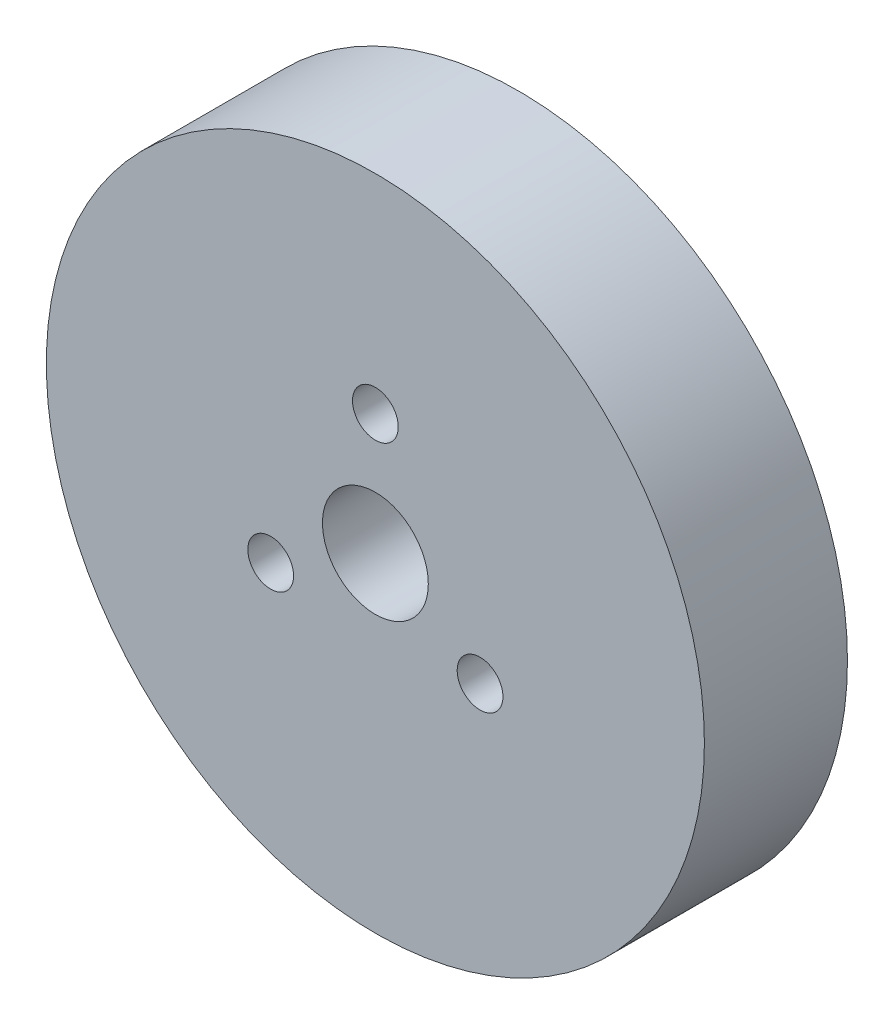
ISO-10303-21;
HEADER;
FILE_DESCRIPTION(('STEP AP214'),'2;1');
FILE_NAME('part.step','',(''),(''),'','','');
FILE_SCHEMA(('AUTOMOTIVE_DESIGN { 1 0 10303 214 1 1 1 1 }'));
ENDSEC;
DATA;
#1=APPLICATION_CONTEXT('core data for automotive mechanical design processes');
#2=APPLICATION_PROTOCOL_DEFINITION('international standard','automotive_design',2000,#1);
#3=PRODUCT_CONTEXT('',#1,'mechanical');
#4=PRODUCT('Part','Part','',(#3));
#5=PRODUCT_RELATED_PRODUCT_CATEGORY('part','',(#4));
#6=PRODUCT_DEFINITION_FORMATION('','',#4);
#7=PRODUCT_DEFINITION_CONTEXT('part definition',#1,'design');
#8=PRODUCT_DEFINITION('design','',#6,#7);
#9=PRODUCT_DEFINITION_SHAPE('','',#8);
#10=(LENGTH_UNIT() NAMED_UNIT(*) SI_UNIT(.MILLI.,.METRE.));
#11=(NAMED_UNIT(*) PLANE_ANGLE_UNIT() SI_UNIT($,.RADIAN.));
#12=(NAMED_UNIT(*) SI_UNIT($,.STERADIAN.) SOLID_ANGLE_UNIT());
#13=UNCERTAINTY_MEASURE_WITH_UNIT(LENGTH_MEASURE(1.E-05),#10,'distance_accuracy_value','');
#14=(GEOMETRIC_REPRESENTATION_CONTEXT(3) GLOBAL_UNCERTAINTY_ASSIGNED_CONTEXT((#13)) GLOBAL_UNIT_ASSIGNED_CONTEXT((#10,
#11,#12)) REPRESENTATION_CONTEXT('',''));
#15=CARTESIAN_POINT('',(0.,0.,0.));
#16=DIRECTION('',(0.,0.,1.));
#17=DIRECTION('',(1.,0.,0.));
#18=AXIS2_PLACEMENT_3D('',#15,#16,#17);
#19=CARTESIAN_POINT('',(0.,0.,10.));
#20=DIRECTION('',(0.,0.,-1.));
#21=DIRECTION('',(-1.,0.,0.));
#22=AXIS2_PLACEMENT_3D('',#19,#20,#21);
#23=CYLINDRICAL_SURFACE('',#22,23.);
#24=CARTESIAN_POINT('',(0.,0.,10.));
#25=DIRECTION('',(0.,0.,1.));
#26=DIRECTION('',(1.,0.,0.));
#27=AXIS2_PLACEMENT_3D('',#24,#25,#26);
#28=CIRCLE('',#27,23.);
#29=CARTESIAN_POINT('',(23.,0.,10.));
#30=VERTEX_POINT('',#29);
#31=EDGE_CURVE('E43',#30,#30,#28,.T.);
#32=ORIENTED_EDGE('',*,*,#31,.F.);
#33=EDGE_LOOP('',(#32));
#34=FACE_BOUND('',#33,.T.);
#35=CARTESIAN_POINT('',(0.,0.,0.));
#36=DIRECTION('',(0.,0.,1.));
#37=DIRECTION('',(1.,0.,0.));
#38=AXIS2_PLACEMENT_3D('',#35,#36,#37);
#39=CIRCLE('',#38,23.);
#40=CARTESIAN_POINT('',(23.,0.,0.));
#41=VERTEX_POINT('',#40);
#42=EDGE_CURVE('E50',#41,#41,#39,.T.);
#43=ORIENTED_EDGE('',*,*,#42,.T.);
#44=EDGE_LOOP('',(#43));
#45=FACE_BOUND('',#44,.T.);
#46=ADVANCED_FACE('F36',(#34,#45),#23,.T.);
#47=CARTESIAN_POINT('',(0.,0.,10.));
#48=DIRECTION('',(0.,0.,-1.));
#49=DIRECTION('',(-1.,0.,0.));
#50=AXIS2_PLACEMENT_3D('',#47,#48,#49);
#51=CYLINDRICAL_SURFACE('',#50,3.7);
#52=CARTESIAN_POINT('',(0.,0.,10.));
#53=DIRECTION('',(0.,0.,1.));
#54=DIRECTION('',(1.,0.,0.));
#55=AXIS2_PLACEMENT_3D('',#52,#53,#54);
#56=CIRCLE('',#55,3.7);
#57=CARTESIAN_POINT('',(3.7,0.,10.));
#58=VERTEX_POINT('',#57);
#59=EDGE_CURVE('E10',#58,#58,#56,.T.);
#60=ORIENTED_EDGE('',*,*,#59,.T.);
#61=EDGE_LOOP('',(#60));
#62=FACE_BOUND('',#61,.T.);
#63=CARTESIAN_POINT('',(0.,0.,0.));
#64=DIRECTION('',(0.,0.,1.));
#65=DIRECTION('',(1.,0.,0.));
#66=AXIS2_PLACEMENT_3D('',#63,#64,#65);
#67=CIRCLE('',#66,3.7);
#68=CARTESIAN_POINT('',(3.7,0.,0.));
#69=VERTEX_POINT('',#68);
#70=EDGE_CURVE('E39',#69,#69,#67,.T.);
#71=ORIENTED_EDGE('',*,*,#70,.F.);
#72=EDGE_LOOP('',(#71));
#73=FACE_BOUND('',#72,.T.);
#74=ADVANCED_FACE('F91',(#62,#73),#51,.F.);
#75=CARTESIAN_POINT('',(0.,0.,10.));
#76=DIRECTION('',(0.,0.,1.));
#77=DIRECTION('',(1.,0.,0.));
#78=AXIS2_PLACEMENT_3D('',#75,#76,#77);
#79=PLANE('',#78);
#80=CARTESIAN_POINT('',(0.,8.45,10.));
#81=DIRECTION('',(0.,0.,-1.));
#82=DIRECTION('',(-1.,0.,0.));
#83=AXIS2_PLACEMENT_3D('',#80,#81,#82);
#84=CIRCLE('',#83,1.60000000000001);
#85=CARTESIAN_POINT('',(-1.60000000000001,8.45,10.));
#86=VERTEX_POINT('',#85);
#87=EDGE_CURVE('E69',#86,#86,#84,.T.);
#88=ORIENTED_EDGE('',*,*,#87,.T.);
#89=EDGE_LOOP('',(#88));
#90=FACE_BOUND('',#89,.T.);
#91=CARTESIAN_POINT('',(7.3179146619785,-4.225,10.));
#92=DIRECTION('',(0.,0.,-1.));
#93=DIRECTION('',(-1.,0.,0.));
#94=AXIS2_PLACEMENT_3D('',#91,#92,#93);
#95=CIRCLE('',#94,1.60000000000001);
#96=CARTESIAN_POINT('',(5.71791466197849,-4.225,10.));
#97=VERTEX_POINT('',#96);
#98=EDGE_CURVE('E61',#97,#97,#95,.T.);
#99=ORIENTED_EDGE('',*,*,#98,.T.);
#100=EDGE_LOOP('',(#99));
#101=FACE_BOUND('',#100,.T.);
#102=CARTESIAN_POINT('',(-7.31791466197851,-4.225,10.));
#103=DIRECTION('',(0.,0.,-1.));
#104=DIRECTION('',(-1.,0.,0.));
#105=AXIS2_PLACEMENT_3D('',#102,#103,#104);
#106=CIRCLE('',#105,1.60000000000001);
#107=CARTESIAN_POINT('',(-8.91791466197852,-4.225,10.));
#108=VERTEX_POINT('',#107);
#109=EDGE_CURVE('E52',#108,#108,#106,.T.);
#110=ORIENTED_EDGE('',*,*,#109,.T.);
#111=EDGE_LOOP('',(#110));
#112=FACE_BOUND('',#111,.T.);
#113=ORIENTED_EDGE('',*,*,#31,.T.);
#114=EDGE_LOOP('',(#113));
#115=FACE_BOUND('',#114,.T.);
#116=ORIENTED_EDGE('',*,*,#59,.F.);
#117=EDGE_LOOP('',(#116));
#118=FACE_BOUND('',#117,.T.);
#119=ADVANCED_FACE('F82',(#90,#101,#112,#115,#118),#79,.T.);
#120=CARTESIAN_POINT('',(0.,0.,0.));
#121=DIRECTION('',(0.,0.,1.));
#122=DIRECTION('',(1.,0.,0.));
#123=AXIS2_PLACEMENT_3D('',#120,#121,#122);
#124=PLANE('',#123);
#125=CARTESIAN_POINT('',(0.,8.45,0.));
#126=DIRECTION('',(0.,0.,-1.));
#127=DIRECTION('',(-1.,0.,0.));
#128=AXIS2_PLACEMENT_3D('',#125,#126,#127);
#129=CIRCLE('',#128,1.60000000000001);
#130=CARTESIAN_POINT('',(-1.60000000000001,8.45,0.));
#131=VERTEX_POINT('',#130);
#132=EDGE_CURVE('E72',#131,#131,#129,.T.);
#133=ORIENTED_EDGE('',*,*,#132,.F.);
#134=EDGE_LOOP('',(#133));
#135=FACE_BOUND('',#134,.T.);
#136=CARTESIAN_POINT('',(7.3179146619785,-4.225,0.));
#137=DIRECTION('',(0.,0.,-1.));
#138=DIRECTION('',(-1.,0.,0.));
#139=AXIS2_PLACEMENT_3D('',#136,#137,#138);
#140=CIRCLE('',#139,1.60000000000002);
#141=CARTESIAN_POINT('',(5.71791466197849,-4.225,0.));
#142=VERTEX_POINT('',#141);
#143=EDGE_CURVE('E66',#142,#142,#140,.T.);
#144=ORIENTED_EDGE('',*,*,#143,.F.);
#145=EDGE_LOOP('',(#144));
#146=FACE_BOUND('',#145,.T.);
#147=CARTESIAN_POINT('',(-7.31791466197851,-4.225,0.));
#148=DIRECTION('',(0.,0.,-1.));
#149=DIRECTION('',(-1.,0.,0.));
#150=AXIS2_PLACEMENT_3D('',#147,#148,#149);
#151=CIRCLE('',#150,1.60000000000001);
#152=CARTESIAN_POINT('',(-8.91791466197852,-4.225,0.));
#153=VERTEX_POINT('',#152);
#154=EDGE_CURVE('E57',#153,#153,#151,.T.);
#155=ORIENTED_EDGE('',*,*,#154,.F.);
#156=EDGE_LOOP('',(#155));
#157=FACE_BOUND('',#156,.T.);
#158=ORIENTED_EDGE('',*,*,#42,.F.);
#159=EDGE_LOOP('',(#158));
#160=FACE_BOUND('',#159,.T.);
#161=ORIENTED_EDGE('',*,*,#70,.T.);
#162=EDGE_LOOP('',(#161));
#163=FACE_BOUND('',#162,.T.);
#164=ADVANCED_FACE('F78',(#135,#146,#157,#160,#163),#124,.F.);
#165=CARTESIAN_POINT('',(-7.31791466197851,-4.225,0.));
#166=DIRECTION('',(0.,0.,-1.));
#167=DIRECTION('',(-1.,0.,0.));
#168=AXIS2_PLACEMENT_3D('',#165,#166,#167);
#169=CYLINDRICAL_SURFACE('',#168,1.60000000000001);
#170=ORIENTED_EDGE('',*,*,#109,.F.);
#171=EDGE_LOOP('',(#170));
#172=FACE_BOUND('',#171,.T.);
#173=ORIENTED_EDGE('',*,*,#154,.T.);
#174=EDGE_LOOP('',(#173));
#175=FACE_BOUND('',#174,.T.);
#176=ADVANCED_FACE('F81',(#172,#175),#169,.F.);
#177=CARTESIAN_POINT('',(7.3179146619785,-4.225,0.));
#178=DIRECTION('',(0.,0.,-1.));
#179=DIRECTION('',(-1.,0.,0.));
#180=AXIS2_PLACEMENT_3D('',#177,#178,#179);
#181=CYLINDRICAL_SURFACE('',#180,1.60000000000001);
#182=ORIENTED_EDGE('',*,*,#98,.F.);
#183=EDGE_LOOP('',(#182));
#184=FACE_BOUND('',#183,.T.);
#185=ORIENTED_EDGE('',*,*,#143,.T.);
#186=EDGE_LOOP('',(#185));
#187=FACE_BOUND('',#186,.T.);
#188=ADVANCED_FACE('F103',(#184,#187),#181,.F.);
#189=CARTESIAN_POINT('',(0.,8.45,0.));
#190=DIRECTION('',(0.,0.,-1.));
#191=DIRECTION('',(-1.,0.,0.));
#192=AXIS2_PLACEMENT_3D('',#189,#190,#191);
#193=CYLINDRICAL_SURFACE('',#192,1.60000000000001);
#194=ORIENTED_EDGE('',*,*,#87,.F.);
#195=EDGE_LOOP('',(#194));
#196=FACE_BOUND('',#195,.T.);
#197=ORIENTED_EDGE('',*,*,#132,.T.);
#198=EDGE_LOOP('',(#197));
#199=FACE_BOUND('',#198,.T.);
#200=ADVANCED_FACE('F76',(#196,#199),#193,.F.);
#201=CLOSED_SHELL('',(#46,#74,#119,#164,#176,#188,#200));
#202=MANIFOLD_SOLID_BREP('B2',#201);
#203=ADVANCED_BREP_SHAPE_REPRESENTATION('',(#18,#202),#14);
#204=SHAPE_DEFINITION_REPRESENTATION(#9,#203);
ENDSEC;
END-ISO-10303-21;
